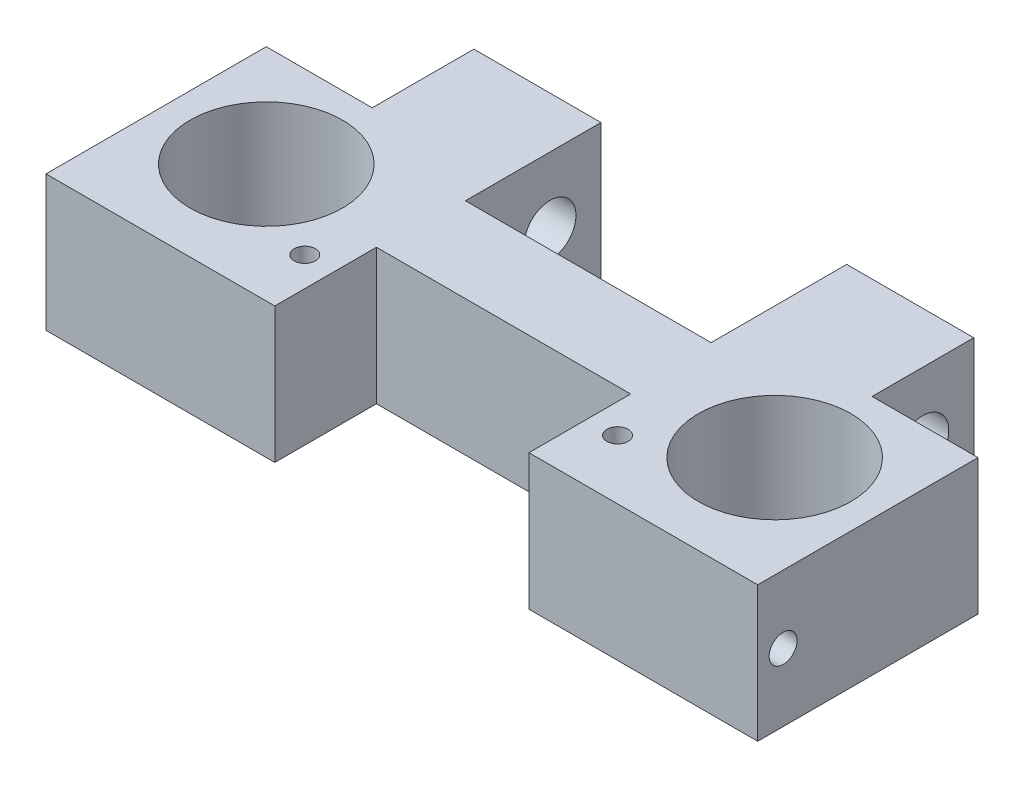
ISO-10303-21;
HEADER;
FILE_DESCRIPTION(('STEP AP214'),'2;1');
FILE_NAME('part.step','',(''),(''),'','','');
FILE_SCHEMA(('AUTOMOTIVE_DESIGN { 1 0 10303 214 1 1 1 1 }'));
ENDSEC;
DATA;
#1=APPLICATION_CONTEXT('core data for automotive mechanical design processes');
#2=APPLICATION_PROTOCOL_DEFINITION('international standard','automotive_design',2000,#1);
#3=PRODUCT_CONTEXT('',#1,'mechanical');
#4=PRODUCT('Part','Part','',(#3));
#5=PRODUCT_RELATED_PRODUCT_CATEGORY('part','',(#4));
#6=PRODUCT_DEFINITION_FORMATION('','',#4);
#7=PRODUCT_DEFINITION_CONTEXT('part definition',#1,'design');
#8=PRODUCT_DEFINITION('design','',#6,#7);
#9=PRODUCT_DEFINITION_SHAPE('','',#8);
#10=(LENGTH_UNIT() NAMED_UNIT(*) SI_UNIT(.MILLI.,.METRE.));
#11=(NAMED_UNIT(*) PLANE_ANGLE_UNIT() SI_UNIT($,.RADIAN.));
#12=(NAMED_UNIT(*) SI_UNIT($,.STERADIAN.) SOLID_ANGLE_UNIT());
#13=UNCERTAINTY_MEASURE_WITH_UNIT(LENGTH_MEASURE(1.E-05),#10,'distance_accuracy_value','');
#14=(GEOMETRIC_REPRESENTATION_CONTEXT(3) GLOBAL_UNCERTAINTY_ASSIGNED_CONTEXT((#13)) GLOBAL_UNIT_ASSIGNED_CONTEXT((#10,
#11,#12)) REPRESENTATION_CONTEXT('',''));
#15=CARTESIAN_POINT('',(0.,0.,0.));
#16=DIRECTION('',(0.,0.,1.));
#17=DIRECTION('',(1.,0.,0.));
#18=AXIS2_PLACEMENT_3D('',#15,#16,#17);
#19=CARTESIAN_POINT('',(-42.,8.00000000000001,13.));
#20=DIRECTION('',(0.,0.,-1.));
#21=DIRECTION('',(-1.,0.,0.));
#22=AXIS2_PLACEMENT_3D('',#19,#20,#21);
#23=PLANE('',#22);
#24=DIRECTION('',(1.,0.,0.));
#25=VECTOR('',#24,1.);
#26=CARTESIAN_POINT('',(-42.,8.00000000000001,13.));
#27=LINE('',#26,#25);
#28=CARTESIAN_POINT('',(15.,8.00000000000001,13.));
#29=VERTEX_POINT('',#28);
#30=CARTESIAN_POINT('',(42.,8.00000000000001,13.));
#31=VERTEX_POINT('',#30);
#32=EDGE_CURVE('E191',#29,#31,#27,.T.);
#33=ORIENTED_EDGE('',*,*,#32,.F.);
#34=DIRECTION('',(0.,-1.,0.));
#35=VECTOR('',#34,1.);
#36=CARTESIAN_POINT('',(15.,8.00100000000001,13.));
#37=LINE('',#36,#35);
#38=CARTESIAN_POINT('',(15.,-8.00000000000001,13.));
#39=VERTEX_POINT('',#38);
#40=EDGE_CURVE('E354',#29,#39,#37,.T.);
#41=ORIENTED_EDGE('',*,*,#40,.T.);
#42=DIRECTION('',(1.,0.,0.));
#43=VECTOR('',#42,1.);
#44=CARTESIAN_POINT('',(-42.,-8.00000000000001,13.));
#45=LINE('',#44,#43);
#46=CARTESIAN_POINT('',(42.,-8.00000000000001,13.));
#47=VERTEX_POINT('',#46);
#48=EDGE_CURVE('E248',#39,#47,#45,.T.);
#49=ORIENTED_EDGE('',*,*,#48,.T.);
#50=DIRECTION('',(0.,-1.,0.));
#51=VECTOR('',#50,1.);
#52=CARTESIAN_POINT('',(42.,8.00000000000001,13.));
#53=LINE('',#52,#51);
#54=EDGE_CURVE('E203',#31,#47,#53,.T.);
#55=ORIENTED_EDGE('',*,*,#54,.F.);
#56=EDGE_LOOP('',(#33,#41,#49,#55));
#57=FACE_BOUND('',#56,.T.);
#58=ADVANCED_FACE('F44',(#57),#23,.F.);
#59=CARTESIAN_POINT('',(0.,8.00000000000001,0.));
#60=DIRECTION('',(0.,1.,0.));
#61=DIRECTION('',(0.,0.,1.));
#62=AXIS2_PLACEMENT_3D('',#59,#60,#61);
#63=PLANE('',#62);
#64=CARTESIAN_POINT('',(-18.4566036193848,8.00000000000001,5.99999999999999));
#65=DIRECTION('',(0.,1.,0.));
#66=DIRECTION('',(0.,0.,1.));
#67=AXIS2_PLACEMENT_3D('',#64,#65,#66);
#68=CIRCLE('',#67,1.24999999999999);
#69=CARTESIAN_POINT('',(-18.4566036193848,8.00000000000001,7.24999999999998));
#70=VERTEX_POINT('',#69);
#71=EDGE_CURVE('E337',#70,#70,#68,.T.);
#72=ORIENTED_EDGE('',*,*,#71,.F.);
#73=EDGE_LOOP('',(#72));
#74=FACE_BOUND('',#73,.T.);
#75=CARTESIAN_POINT('',(18.4566036193848,8.00000000000001,5.99999999999999));
#76=DIRECTION('',(0.,1.,0.));
#77=DIRECTION('',(0.,0.,1.));
#78=AXIS2_PLACEMENT_3D('',#75,#76,#77);
#79=CIRCLE('',#78,1.24999999999999);
#80=CARTESIAN_POINT('',(18.4566036193848,8.00000000000001,7.24999999999998));
#81=VERTEX_POINT('',#80);
#82=EDGE_CURVE('E336',#81,#81,#79,.T.);
#83=ORIENTED_EDGE('',*,*,#82,.F.);
#84=EDGE_LOOP('',(#83));
#85=FACE_BOUND('',#84,.T.);
#86=DIRECTION('',(0.,0.,1.));
#87=VECTOR('',#86,1.);
#88=CARTESIAN_POINT('',(15.,8.00000000000001,0.999999999999994));
#89=LINE('',#88,#87);
#90=CARTESIAN_POINT('',(15.,8.00000000000001,0.999999999999994));
#91=VERTEX_POINT('',#90);
#92=EDGE_CURVE('E393',#91,#29,#89,.T.);
#93=ORIENTED_EDGE('',*,*,#92,.T.);
#94=ORIENTED_EDGE('',*,*,#32,.T.);
#95=DIRECTION('',(0.,0.,-1.));
#96=VECTOR('',#95,1.);
#97=CARTESIAN_POINT('',(42.,8.00000000000001,13.));
#98=LINE('',#97,#96);
#99=CARTESIAN_POINT('',(42.,8.00000000000001,-13.));
#100=VERTEX_POINT('',#99);
#101=EDGE_CURVE('E75',#31,#100,#98,.T.);
#102=ORIENTED_EDGE('',*,*,#101,.T.);
#103=DIRECTION('',(-1.,0.,0.));
#104=VECTOR('',#103,1.);
#105=CARTESIAN_POINT('',(29.5,8.00000000000001,-13.));
#106=LINE('',#105,#104);
#107=CARTESIAN_POINT('',(29.5,8.00000000000001,-13.));
#108=VERTEX_POINT('',#107);
#109=EDGE_CURVE('E254',#100,#108,#106,.T.);
#110=ORIENTED_EDGE('',*,*,#109,.T.);
#111=DIRECTION('',(0.,0.,-1.));
#112=VECTOR('',#111,1.);
#113=CARTESIAN_POINT('',(29.5,8.00000000000001,-13.));
#114=LINE('',#113,#112);
#115=CARTESIAN_POINT('',(29.5,8.00000000000001,-25.));
#116=VERTEX_POINT('',#115);
#117=EDGE_CURVE('E143',#108,#116,#114,.T.);
#118=ORIENTED_EDGE('',*,*,#117,.T.);
#119=DIRECTION('',(-1.,0.,0.));
#120=VECTOR('',#119,1.);
#121=CARTESIAN_POINT('',(29.5,8.00000000000001,-25.));
#122=LINE('',#121,#120);
#123=CARTESIAN_POINT('',(14.5,8.00000000000001,-25.));
#124=VERTEX_POINT('',#123);
#125=EDGE_CURVE('E292',#116,#124,#122,.T.);
#126=ORIENTED_EDGE('',*,*,#125,.T.);
#127=DIRECTION('',(0.,0.,1.));
#128=VECTOR('',#127,1.);
#129=CARTESIAN_POINT('',(14.5,8.00000000000001,-25.));
#130=LINE('',#129,#128);
#131=CARTESIAN_POINT('',(14.5,8.00000000000001,-9.00000000000001));
#132=VERTEX_POINT('',#131);
#133=EDGE_CURVE('E313',#124,#132,#130,.T.);
#134=ORIENTED_EDGE('',*,*,#133,.T.);
#135=DIRECTION('',(-1.,0.,0.));
#136=VECTOR('',#135,1.);
#137=CARTESIAN_POINT('',(-14.5,8.00000000000001,-9.));
#138=LINE('',#137,#136);
#139=CARTESIAN_POINT('',(-14.5,8.00000000000001,-9.));
#140=VERTEX_POINT('',#139);
#141=EDGE_CURVE('E309',#132,#140,#138,.T.);
#142=ORIENTED_EDGE('',*,*,#141,.T.);
#143=DIRECTION('',(0.,0.,-1.));
#144=VECTOR('',#143,1.);
#145=CARTESIAN_POINT('',(-14.5,8.00000000000001,-25.));
#146=LINE('',#145,#144);
#147=CARTESIAN_POINT('',(-14.5,8.00000000000001,-25.));
#148=VERTEX_POINT('',#147);
#149=EDGE_CURVE('E312',#140,#148,#146,.T.);
#150=ORIENTED_EDGE('',*,*,#149,.T.);
#151=DIRECTION('',(-1.,0.,0.));
#152=VECTOR('',#151,1.);
#153=CARTESIAN_POINT('',(-29.5,8.00000000000001,-25.));
#154=LINE('',#153,#152);
#155=CARTESIAN_POINT('',(-29.5,8.00000000000001,-25.));
#156=VERTEX_POINT('',#155);
#157=EDGE_CURVE('E317',#148,#156,#154,.T.);
#158=ORIENTED_EDGE('',*,*,#157,.T.);
#159=DIRECTION('',(0.,0.,1.));
#160=VECTOR('',#159,1.);
#161=CARTESIAN_POINT('',(-29.5,8.00000000000001,-13.));
#162=LINE('',#161,#160);
#163=CARTESIAN_POINT('',(-29.5,8.00000000000001,-13.));
#164=VERTEX_POINT('',#163);
#165=EDGE_CURVE('E325',#156,#164,#162,.T.);
#166=ORIENTED_EDGE('',*,*,#165,.T.);
#167=DIRECTION('',(-1.,0.,0.));
#168=VECTOR('',#167,1.);
#169=CARTESIAN_POINT('',(-42.,8.00000000000001,-13.));
#170=LINE('',#169,#168);
#171=CARTESIAN_POINT('',(-42.,8.00000000000001,-13.));
#172=VERTEX_POINT('',#171);
#173=EDGE_CURVE('E186',#164,#172,#170,.T.);
#174=ORIENTED_EDGE('',*,*,#173,.T.);
#175=DIRECTION('',(0.,0.,1.));
#176=VECTOR('',#175,1.);
#177=CARTESIAN_POINT('',(-42.,8.00000000000001,13.));
#178=LINE('',#177,#176);
#179=CARTESIAN_POINT('',(-42.,8.00000000000001,13.));
#180=VERTEX_POINT('',#179);
#181=EDGE_CURVE('E178',#172,#180,#178,.T.);
#182=ORIENTED_EDGE('',*,*,#181,.T.);
#183=CARTESIAN_POINT('',(-15.,8.00000000000001,13.));
#184=VERTEX_POINT('',#183);
#185=EDGE_CURVE('E184',#180,#184,#27,.T.);
#186=ORIENTED_EDGE('',*,*,#185,.T.);
#187=DIRECTION('',(0.,0.,-1.));
#188=VECTOR('',#187,1.);
#189=CARTESIAN_POINT('',(-15.,8.00000000000001,0.999999999999994));
#190=LINE('',#189,#188);
#191=CARTESIAN_POINT('',(-15.,8.00000000000001,0.999999999999994));
#192=VERTEX_POINT('',#191);
#193=EDGE_CURVE('E63',#184,#192,#190,.T.);
#194=ORIENTED_EDGE('',*,*,#193,.T.);
#195=DIRECTION('',(1.,0.,0.));
#196=VECTOR('',#195,1.);
#197=CARTESIAN_POINT('',(-15.,8.00000000000001,0.999999999999994));
#198=LINE('',#197,#196);
#199=EDGE_CURVE('E389',#192,#91,#198,.T.);
#200=ORIENTED_EDGE('',*,*,#199,.T.);
#201=EDGE_LOOP('',(#93,#94,#102,#110,#118,#126,#134,#142,#150,#158,#166,#174,#182,#186,#194,#200));
#202=FACE_BOUND('',#201,.T.);
#203=CARTESIAN_POINT('',(-30.,8.00000000000001,-1.));
#204=DIRECTION('',(0.,1.,0.));
#205=DIRECTION('',(0.,0.,1.));
#206=AXIS2_PLACEMENT_3D('',#203,#204,#205);
#207=CIRCLE('',#206,9.);
#208=CARTESIAN_POINT('',(-30.,8.00000000000001,8.));
#209=VERTEX_POINT('',#208);
#210=EDGE_CURVE('E222',#209,#209,#207,.T.);
#211=ORIENTED_EDGE('',*,*,#210,.F.);
#212=EDGE_LOOP('',(#211));
#213=FACE_BOUND('',#212,.T.);
#214=CARTESIAN_POINT('',(30.,8.00000000000001,-1.));
#215=DIRECTION('',(0.,1.,0.));
#216=DIRECTION('',(0.,0.,-1.));
#217=AXIS2_PLACEMENT_3D('',#214,#215,#216);
#218=CIRCLE('',#217,9.00000000000001);
#219=CARTESIAN_POINT('',(30.,8.00000000000001,-10.));
#220=VERTEX_POINT('',#219);
#221=EDGE_CURVE('E362',#220,#220,#218,.T.);
#222=ORIENTED_EDGE('',*,*,#221,.F.);
#223=EDGE_LOOP('',(#222));
#224=FACE_BOUND('',#223,.T.);
#225=ADVANCED_FACE('F181',(#74,#85,#202,#213,#224),#63,.T.);
#226=CARTESIAN_POINT('',(0.,-8.00000000000001,0.));
#227=DIRECTION('',(0.,1.,0.));
#228=DIRECTION('',(0.,0.,1.));
#229=AXIS2_PLACEMENT_3D('',#226,#227,#228);
#230=PLANE('',#229);
#231=CARTESIAN_POINT('',(-30.,-8.00000000000001,-1.));
#232=DIRECTION('',(0.,1.,0.));
#233=DIRECTION('',(0.,0.,1.));
#234=AXIS2_PLACEMENT_3D('',#231,#232,#233);
#235=CIRCLE('',#234,9.);
#236=CARTESIAN_POINT('',(-30.,-8.00000000000001,8.));
#237=VERTEX_POINT('',#236);
#238=EDGE_CURVE('E331',#237,#237,#235,.T.);
#239=ORIENTED_EDGE('',*,*,#238,.T.);
#240=EDGE_LOOP('',(#239));
#241=FACE_BOUND('',#240,.T.);
#242=ORIENTED_EDGE('',*,*,#48,.F.);
#243=DIRECTION('',(0.,0.,1.));
#244=VECTOR('',#243,1.);
#245=CARTESIAN_POINT('',(15.,-8.00000000000001,0.999999999999994));
#246=LINE('',#245,#244);
#247=CARTESIAN_POINT('',(15.,-8.00000000000001,0.999999999999994));
#248=VERTEX_POINT('',#247);
#249=EDGE_CURVE('E350',#248,#39,#246,.T.);
#250=ORIENTED_EDGE('',*,*,#249,.F.);
#251=DIRECTION('',(1.,0.,0.));
#252=VECTOR('',#251,1.);
#253=CARTESIAN_POINT('',(-15.,-8.00000000000001,0.999999999999994));
#254=LINE('',#253,#252);
#255=CARTESIAN_POINT('',(-15.,-8.00000000000001,0.999999999999994));
#256=VERTEX_POINT('',#255);
#257=EDGE_CURVE('E349',#256,#248,#254,.T.);
#258=ORIENTED_EDGE('',*,*,#257,.F.);
#259=DIRECTION('',(0.,0.,-1.));
#260=VECTOR('',#259,1.);
#261=CARTESIAN_POINT('',(-15.,-8.00000000000001,0.999999999999994));
#262=LINE('',#261,#260);
#263=CARTESIAN_POINT('',(-15.,-8.00000000000001,13.));
#264=VERTEX_POINT('',#263);
#265=EDGE_CURVE('E346',#264,#256,#262,.T.);
#266=ORIENTED_EDGE('',*,*,#265,.F.);
#267=CARTESIAN_POINT('',(-42.,-8.00000000000001,13.));
#268=VERTEX_POINT('',#267);
#269=EDGE_CURVE('E249',#268,#264,#45,.T.);
#270=ORIENTED_EDGE('',*,*,#269,.F.);
#271=DIRECTION('',(0.,0.,1.));
#272=VECTOR('',#271,1.);
#273=CARTESIAN_POINT('',(-42.,-8.00000000000001,13.));
#274=LINE('',#273,#272);
#275=CARTESIAN_POINT('',(-42.,-8.00000000000001,-13.));
#276=VERTEX_POINT('',#275);
#277=EDGE_CURVE('E197',#276,#268,#274,.T.);
#278=ORIENTED_EDGE('',*,*,#277,.F.);
#279=DIRECTION('',(-1.,0.,0.));
#280=VECTOR('',#279,1.);
#281=CARTESIAN_POINT('',(-42.,-8.00000000000001,-13.));
#282=LINE('',#281,#280);
#283=CARTESIAN_POINT('',(-29.5,-8.00000000000001,-13.));
#284=VERTEX_POINT('',#283);
#285=EDGE_CURVE('E243',#284,#276,#282,.T.);
#286=ORIENTED_EDGE('',*,*,#285,.F.);
#287=DIRECTION('',(0.,0.,1.));
#288=VECTOR('',#287,1.);
#289=CARTESIAN_POINT('',(-29.5,-8.00000000000001,-13.));
#290=LINE('',#289,#288);
#291=CARTESIAN_POINT('',(-29.5,-8.00000000000001,-25.));
#292=VERTEX_POINT('',#291);
#293=EDGE_CURVE('E240',#292,#284,#290,.T.);
#294=ORIENTED_EDGE('',*,*,#293,.F.);
#295=DIRECTION('',(-1.,0.,0.));
#296=VECTOR('',#295,1.);
#297=CARTESIAN_POINT('',(-29.5,-8.00000000000001,-25.));
#298=LINE('',#297,#296);
#299=CARTESIAN_POINT('',(-14.5,-8.00000000000001,-25.));
#300=VERTEX_POINT('',#299);
#301=EDGE_CURVE('E237',#300,#292,#298,.T.);
#302=ORIENTED_EDGE('',*,*,#301,.F.);
#303=DIRECTION('',(0.,0.,-1.));
#304=VECTOR('',#303,1.);
#305=CARTESIAN_POINT('',(-14.5,-8.00000000000001,-25.));
#306=LINE('',#305,#304);
#307=CARTESIAN_POINT('',(-14.5,-8.00000000000001,-9.));
#308=VERTEX_POINT('',#307);
#309=EDGE_CURVE('E234',#308,#300,#306,.T.);
#310=ORIENTED_EDGE('',*,*,#309,.F.);
#311=DIRECTION('',(-1.,0.,0.));
#312=VECTOR('',#311,1.);
#313=CARTESIAN_POINT('',(-14.5,-8.00000000000001,-9.));
#314=LINE('',#313,#312);
#315=CARTESIAN_POINT('',(14.5,-8.00000000000001,-9.00000000000001));
#316=VERTEX_POINT('',#315);
#317=EDGE_CURVE('E231',#316,#308,#314,.T.);
#318=ORIENTED_EDGE('',*,*,#317,.F.);
#319=DIRECTION('',(0.,0.,1.));
#320=VECTOR('',#319,1.);
#321=CARTESIAN_POINT('',(14.5,-8.00000000000001,-25.));
#322=LINE('',#321,#320);
#323=CARTESIAN_POINT('',(14.5,-8.00000000000001,-25.));
#324=VERTEX_POINT('',#323);
#325=EDGE_CURVE('E228',#324,#316,#322,.T.);
#326=ORIENTED_EDGE('',*,*,#325,.F.);
#327=DIRECTION('',(-1.,0.,0.));
#328=VECTOR('',#327,1.);
#329=CARTESIAN_POINT('',(29.5,-8.00000000000001,-25.));
#330=LINE('',#329,#328);
#331=CARTESIAN_POINT('',(29.5,-8.00000000000001,-25.));
#332=VERTEX_POINT('',#331);
#333=EDGE_CURVE('E225',#332,#324,#330,.T.);
#334=ORIENTED_EDGE('',*,*,#333,.F.);
#335=DIRECTION('',(0.,0.,-1.));
#336=VECTOR('',#335,1.);
#337=CARTESIAN_POINT('',(29.5,-8.00000000000001,-13.));
#338=LINE('',#337,#336);
#339=CARTESIAN_POINT('',(29.5,-8.00000000000001,-13.));
#340=VERTEX_POINT('',#339);
#341=EDGE_CURVE('E221',#340,#332,#338,.T.);
#342=ORIENTED_EDGE('',*,*,#341,.F.);
#343=DIRECTION('',(-1.,0.,0.));
#344=VECTOR('',#343,1.);
#345=CARTESIAN_POINT('',(29.5,-8.00000000000001,-13.));
#346=LINE('',#345,#344);
#347=CARTESIAN_POINT('',(42.,-8.00000000000001,-13.));
#348=VERTEX_POINT('',#347);
#349=EDGE_CURVE('E217',#348,#340,#346,.T.);
#350=ORIENTED_EDGE('',*,*,#349,.F.);
#351=DIRECTION('',(0.,0.,-1.));
#352=VECTOR('',#351,1.);
#353=CARTESIAN_POINT('',(42.,-8.00000000000001,13.));
#354=LINE('',#353,#352);
#355=EDGE_CURVE('E132',#47,#348,#354,.T.);
#356=ORIENTED_EDGE('',*,*,#355,.F.);
#357=EDGE_LOOP('',(#242,#250,#258,#266,#270,#278,#286,#294,#302,#310,#318,#326,#334,#342,#350,#356));
#358=FACE_BOUND('',#357,.T.);
#359=CARTESIAN_POINT('',(30.,-8.00000000000001,-1.));
#360=DIRECTION('',(0.,1.,0.));
#361=DIRECTION('',(0.,0.,-1.));
#362=AXIS2_PLACEMENT_3D('',#359,#360,#361);
#363=CIRCLE('',#362,9.00000000000001);
#364=CARTESIAN_POINT('',(30.,-8.00000000000001,-10.));
#365=VERTEX_POINT('',#364);
#366=EDGE_CURVE('E416',#365,#365,#363,.T.);
#367=ORIENTED_EDGE('',*,*,#366,.T.);
#368=EDGE_LOOP('',(#367));
#369=FACE_BOUND('',#368,.T.);
#370=ADVANCED_FACE('F296',(#241,#358,#369),#230,.F.);
#371=CARTESIAN_POINT('',(29.5,8.00000000000001,-13.));
#372=DIRECTION('',(0.,0.,1.));
#373=DIRECTION('',(1.,0.,0.));
#374=AXIS2_PLACEMENT_3D('',#371,#372,#373);
#375=PLANE('',#374);
#376=ORIENTED_EDGE('',*,*,#349,.T.);
#377=DIRECTION('',(0.,-1.,0.));
#378=VECTOR('',#377,1.);
#379=CARTESIAN_POINT('',(29.5,8.00000000000001,-13.));
#380=LINE('',#379,#378);
#381=EDGE_CURVE('E11',#108,#340,#380,.T.);
#382=ORIENTED_EDGE('',*,*,#381,.F.);
#383=ORIENTED_EDGE('',*,*,#109,.F.);
#384=DIRECTION('',(0.,-1.,0.));
#385=VECTOR('',#384,1.);
#386=CARTESIAN_POINT('',(42.,8.00000000000001,-13.));
#387=LINE('',#386,#385);
#388=EDGE_CURVE('E212',#100,#348,#387,.T.);
#389=ORIENTED_EDGE('',*,*,#388,.T.);
#390=EDGE_LOOP('',(#376,#382,#383,#389));
#391=FACE_BOUND('',#390,.T.);
#392=ADVANCED_FACE('F46',(#391),#375,.F.);
#393=CARTESIAN_POINT('',(29.5,8.00000000000001,-13.));
#394=DIRECTION('',(-1.,0.,0.));
#395=DIRECTION('',(0.,0.,1.));
#396=AXIS2_PLACEMENT_3D('',#393,#394,#395);
#397=PLANE('',#396);
#398=CARTESIAN_POINT('',(29.5,0.,-19.));
#399=DIRECTION('',(-1.,0.,0.));
#400=DIRECTION('',(0.,0.,1.));
#401=AXIS2_PLACEMENT_3D('',#398,#399,#400);
#402=CIRCLE('',#401,3.05);
#403=CARTESIAN_POINT('',(29.5,0.,-15.95));
#404=VERTEX_POINT('',#403);
#405=EDGE_CURVE('E412',#404,#404,#402,.T.);
#406=ORIENTED_EDGE('',*,*,#405,.T.);
#407=EDGE_LOOP('',(#406));
#408=FACE_BOUND('',#407,.T.);
#409=ORIENTED_EDGE('',*,*,#341,.T.);
#410=DIRECTION('',(0.,-1.,0.));
#411=VECTOR('',#410,1.);
#412=CARTESIAN_POINT('',(29.5,8.00000000000001,-25.));
#413=LINE('',#412,#411);
#414=EDGE_CURVE('E53',#116,#332,#413,.T.);
#415=ORIENTED_EDGE('',*,*,#414,.F.);
#416=ORIENTED_EDGE('',*,*,#117,.F.);
#417=ORIENTED_EDGE('',*,*,#381,.T.);
#418=EDGE_LOOP('',(#409,#415,#416,#417));
#419=FACE_BOUND('',#418,.T.);
#420=ADVANCED_FACE('F429',(#408,#419),#397,.F.);
#421=CARTESIAN_POINT('',(29.5,8.00000000000001,-25.));
#422=DIRECTION('',(0.,0.,1.));
#423=DIRECTION('',(1.,0.,0.));
#424=AXIS2_PLACEMENT_3D('',#421,#422,#423);
#425=PLANE('',#424);
#426=ORIENTED_EDGE('',*,*,#333,.T.);
#427=DIRECTION('',(0.,-1.,0.));
#428=VECTOR('',#427,1.);
#429=CARTESIAN_POINT('',(14.5,8.00000000000001,-25.));
#430=LINE('',#429,#428);
#431=EDGE_CURVE('E281',#124,#324,#430,.T.);
#432=ORIENTED_EDGE('',*,*,#431,.F.);
#433=ORIENTED_EDGE('',*,*,#125,.F.);
#434=ORIENTED_EDGE('',*,*,#414,.T.);
#435=EDGE_LOOP('',(#426,#432,#433,#434));
#436=FACE_BOUND('',#435,.T.);
#437=ADVANCED_FACE('F290',(#436),#425,.F.);
#438=CARTESIAN_POINT('',(14.5,8.00000000000001,-25.));
#439=DIRECTION('',(1.,0.,0.));
#440=DIRECTION('',(0.,0.,-1.));
#441=AXIS2_PLACEMENT_3D('',#438,#439,#440);
#442=PLANE('',#441);
#443=CARTESIAN_POINT('',(14.5,0.,-19.));
#444=DIRECTION('',(1.,0.,0.));
#445=DIRECTION('',(0.,0.,-1.));
#446=AXIS2_PLACEMENT_3D('',#443,#444,#445);
#447=CIRCLE('',#446,3.05);
#448=CARTESIAN_POINT('',(14.5,0.,-22.05));
#449=VERTEX_POINT('',#448);
#450=EDGE_CURVE('E408',#449,#449,#447,.T.);
#451=ORIENTED_EDGE('',*,*,#450,.T.);
#452=EDGE_LOOP('',(#451));
#453=FACE_BOUND('',#452,.T.);
#454=ORIENTED_EDGE('',*,*,#325,.T.);
#455=DIRECTION('',(0.,-1.,0.));
#456=VECTOR('',#455,1.);
#457=CARTESIAN_POINT('',(14.5,8.00000000000001,-9.00000000000001));
#458=LINE('',#457,#456);
#459=EDGE_CURVE('E277',#132,#316,#458,.T.);
#460=ORIENTED_EDGE('',*,*,#459,.F.);
#461=ORIENTED_EDGE('',*,*,#133,.F.);
#462=ORIENTED_EDGE('',*,*,#431,.T.);
#463=EDGE_LOOP('',(#454,#460,#461,#462));
#464=FACE_BOUND('',#463,.T.);
#465=ADVANCED_FACE('F303',(#453,#464),#442,.F.);
#466=CARTESIAN_POINT('',(-14.5,8.00000000000001,-9.));
#467=DIRECTION('',(0.,0.,1.));
#468=DIRECTION('',(1.,0.,0.));
#469=AXIS2_PLACEMENT_3D('',#466,#467,#468);
#470=PLANE('',#469);
#471=ORIENTED_EDGE('',*,*,#317,.T.);
#472=DIRECTION('',(0.,-1.,0.));
#473=VECTOR('',#472,1.);
#474=CARTESIAN_POINT('',(-14.5,8.00000000000001,-9.));
#475=LINE('',#474,#473);
#476=EDGE_CURVE('E273',#140,#308,#475,.T.);
#477=ORIENTED_EDGE('',*,*,#476,.F.);
#478=ORIENTED_EDGE('',*,*,#141,.F.);
#479=ORIENTED_EDGE('',*,*,#459,.T.);
#480=EDGE_LOOP('',(#471,#477,#478,#479));
#481=FACE_BOUND('',#480,.T.);
#482=ADVANCED_FACE('F307',(#481),#470,.F.);
#483=CARTESIAN_POINT('',(-14.5,8.00000000000001,-25.));
#484=DIRECTION('',(-1.,0.,0.));
#485=DIRECTION('',(0.,0.,1.));
#486=AXIS2_PLACEMENT_3D('',#483,#484,#485);
#487=PLANE('',#486);
#488=CARTESIAN_POINT('',(-14.5,0.,-19.));
#489=DIRECTION('',(-1.,0.,0.));
#490=DIRECTION('',(0.,0.,1.));
#491=AXIS2_PLACEMENT_3D('',#488,#489,#490);
#492=CIRCLE('',#491,3.05);
#493=CARTESIAN_POINT('',(-14.5,0.,-15.95));
#494=VERTEX_POINT('',#493);
#495=EDGE_CURVE('E342',#494,#494,#492,.T.);
#496=ORIENTED_EDGE('',*,*,#495,.T.);
#497=EDGE_LOOP('',(#496));
#498=FACE_BOUND('',#497,.T.);
#499=ORIENTED_EDGE('',*,*,#309,.T.);
#500=DIRECTION('',(0.,-1.,0.));
#501=VECTOR('',#500,1.);
#502=CARTESIAN_POINT('',(-14.5,8.00000000000001,-25.));
#503=LINE('',#502,#501);
#504=EDGE_CURVE('E269',#148,#300,#503,.T.);
#505=ORIENTED_EDGE('',*,*,#504,.F.);
#506=ORIENTED_EDGE('',*,*,#149,.F.);
#507=ORIENTED_EDGE('',*,*,#476,.T.);
#508=EDGE_LOOP('',(#499,#505,#506,#507));
#509=FACE_BOUND('',#508,.T.);
#510=ADVANCED_FACE('F471',(#498,#509),#487,.F.);
#511=CARTESIAN_POINT('',(-29.5,8.00000000000001,-25.));
#512=DIRECTION('',(0.,0.,1.));
#513=DIRECTION('',(1.,0.,0.));
#514=AXIS2_PLACEMENT_3D('',#511,#512,#513);
#515=PLANE('',#514);
#516=ORIENTED_EDGE('',*,*,#301,.T.);
#517=DIRECTION('',(0.,-1.,0.));
#518=VECTOR('',#517,1.);
#519=CARTESIAN_POINT('',(-29.5,8.00000000000001,-25.));
#520=LINE('',#519,#518);
#521=EDGE_CURVE('E265',#156,#292,#520,.T.);
#522=ORIENTED_EDGE('',*,*,#521,.F.);
#523=ORIENTED_EDGE('',*,*,#157,.F.);
#524=ORIENTED_EDGE('',*,*,#504,.T.);
#525=EDGE_LOOP('',(#516,#522,#523,#524));
#526=FACE_BOUND('',#525,.T.);
#527=ADVANCED_FACE('F467',(#526),#515,.F.);
#528=CARTESIAN_POINT('',(-29.5,8.00000000000001,-13.));
#529=DIRECTION('',(1.,0.,0.));
#530=DIRECTION('',(0.,0.,-1.));
#531=AXIS2_PLACEMENT_3D('',#528,#529,#530);
#532=PLANE('',#531);
#533=CARTESIAN_POINT('',(-29.5,0.,-19.));
#534=DIRECTION('',(-1.,0.,0.));
#535=DIRECTION('',(0.,0.,1.));
#536=AXIS2_PLACEMENT_3D('',#533,#534,#535);
#537=CIRCLE('',#536,3.05);
#538=CARTESIAN_POINT('',(-29.5,0.,-15.95));
#539=VERTEX_POINT('',#538);
#540=EDGE_CURVE('E340',#539,#539,#537,.T.);
#541=ORIENTED_EDGE('',*,*,#540,.F.);
#542=EDGE_LOOP('',(#541));
#543=FACE_BOUND('',#542,.T.);
#544=ORIENTED_EDGE('',*,*,#293,.T.);
#545=DIRECTION('',(0.,-1.,0.));
#546=VECTOR('',#545,1.);
#547=CARTESIAN_POINT('',(-29.5,8.00000000000001,-13.));
#548=LINE('',#547,#546);
#549=EDGE_CURVE('E261',#164,#284,#548,.T.);
#550=ORIENTED_EDGE('',*,*,#549,.F.);
#551=ORIENTED_EDGE('',*,*,#165,.F.);
#552=ORIENTED_EDGE('',*,*,#521,.T.);
#553=EDGE_LOOP('',(#544,#550,#551,#552));
#554=FACE_BOUND('',#553,.T.);
#555=ADVANCED_FACE('F461',(#543,#554),#532,.F.);
#556=CARTESIAN_POINT('',(-42.,8.00000000000001,-13.));
#557=DIRECTION('',(0.,0.,1.));
#558=DIRECTION('',(1.,0.,0.));
#559=AXIS2_PLACEMENT_3D('',#556,#557,#558);
#560=PLANE('',#559);
#561=ORIENTED_EDGE('',*,*,#285,.T.);
#562=DIRECTION('',(0.,-1.,0.));
#563=VECTOR('',#562,1.);
#564=CARTESIAN_POINT('',(-42.,8.00000000000001,-13.));
#565=LINE('',#564,#563);
#566=EDGE_CURVE('E202',#172,#276,#565,.T.);
#567=ORIENTED_EDGE('',*,*,#566,.F.);
#568=ORIENTED_EDGE('',*,*,#173,.F.);
#569=ORIENTED_EDGE('',*,*,#549,.T.);
#570=EDGE_LOOP('',(#561,#567,#568,#569));
#571=FACE_BOUND('',#570,.T.);
#572=ADVANCED_FACE('F456',(#571),#560,.F.);
#573=CARTESIAN_POINT('',(-42.,8.00000000000001,13.));
#574=DIRECTION('',(1.,0.,0.));
#575=DIRECTION('',(0.,0.,-1.));
#576=AXIS2_PLACEMENT_3D('',#573,#574,#575);
#577=PLANE('',#576);
#578=CARTESIAN_POINT('',(-42.,0.,10.));
#579=DIRECTION('',(-1.,0.,0.));
#580=DIRECTION('',(0.,0.,1.));
#581=AXIS2_PLACEMENT_3D('',#578,#579,#580);
#582=CIRCLE('',#581,1.64999999999999);
#583=CARTESIAN_POINT('',(-42.,0.,11.65));
#584=VERTEX_POINT('',#583);
#585=EDGE_CURVE('E367',#584,#584,#582,.T.);
#586=ORIENTED_EDGE('',*,*,#585,.F.);
#587=EDGE_LOOP('',(#586));
#588=FACE_BOUND('',#587,.T.);
#589=ORIENTED_EDGE('',*,*,#277,.T.);
#590=DIRECTION('',(0.,-1.,0.));
#591=VECTOR('',#590,1.);
#592=CARTESIAN_POINT('',(-42.,8.00000000000001,13.));
#593=LINE('',#592,#591);
#594=EDGE_CURVE('E194',#180,#268,#593,.T.);
#595=ORIENTED_EDGE('',*,*,#594,.F.);
#596=ORIENTED_EDGE('',*,*,#181,.F.);
#597=ORIENTED_EDGE('',*,*,#566,.T.);
#598=EDGE_LOOP('',(#589,#595,#596,#597));
#599=FACE_BOUND('',#598,.T.);
#600=ADVANCED_FACE('F195',(#588,#599),#577,.F.);
#601=ORIENTED_EDGE('',*,*,#269,.T.);
#602=DIRECTION('',(0.,-1.,0.));
#603=VECTOR('',#602,1.);
#604=CARTESIAN_POINT('',(-15.,8.00100000000001,13.));
#605=LINE('',#604,#603);
#606=EDGE_CURVE('E206',#184,#264,#605,.T.);
#607=ORIENTED_EDGE('',*,*,#606,.F.);
#608=ORIENTED_EDGE('',*,*,#185,.F.);
#609=ORIENTED_EDGE('',*,*,#594,.T.);
#610=EDGE_LOOP('',(#601,#607,#608,#609));
#611=FACE_BOUND('',#610,.T.);
#612=ADVANCED_FACE('F205',(#611),#23,.F.);
#613=CARTESIAN_POINT('',(42.,8.00000000000001,13.));
#614=DIRECTION('',(-1.,0.,0.));
#615=DIRECTION('',(0.,0.,1.));
#616=AXIS2_PLACEMENT_3D('',#613,#614,#615);
#617=PLANE('',#616);
#618=CARTESIAN_POINT('',(42.,0.,10.));
#619=DIRECTION('',(1.,0.,0.));
#620=DIRECTION('',(0.,0.,-1.));
#621=AXIS2_PLACEMENT_3D('',#618,#619,#620);
#622=CIRCLE('',#621,1.64999999999999);
#623=CARTESIAN_POINT('',(42.,0.,8.35000000000001));
#624=VERTEX_POINT('',#623);
#625=EDGE_CURVE('E366',#624,#624,#622,.T.);
#626=ORIENTED_EDGE('',*,*,#625,.F.);
#627=EDGE_LOOP('',(#626));
#628=FACE_BOUND('',#627,.T.);
#629=ORIENTED_EDGE('',*,*,#355,.T.);
#630=ORIENTED_EDGE('',*,*,#388,.F.);
#631=ORIENTED_EDGE('',*,*,#101,.F.);
#632=ORIENTED_EDGE('',*,*,#54,.T.);
#633=EDGE_LOOP('',(#629,#630,#631,#632));
#634=FACE_BOUND('',#633,.T.);
#635=ADVANCED_FACE('F449',(#628,#634),#617,.F.);
#636=CARTESIAN_POINT('',(-30.,8.00000000000001,-1.));
#637=DIRECTION('',(0.,-1.,0.));
#638=DIRECTION('',(0.,0.,-1.));
#639=AXIS2_PLACEMENT_3D('',#636,#637,#638);
#640=CYLINDRICAL_SURFACE('',#639,9.);
#641=ORIENTED_EDGE('',*,*,#210,.T.);
#642=EDGE_LOOP('',(#641));
#643=FACE_BOUND('',#642,.T.);
#644=ORIENTED_EDGE('',*,*,#238,.F.);
#645=EDGE_LOOP('',(#644));
#646=FACE_BOUND('',#645,.T.);
#647=ADVANCED_FACE('F454',(#643,#646),#640,.F.);
#648=CARTESIAN_POINT('',(30.,8.00000000000001,-1.));
#649=DIRECTION('',(0.,-1.,0.));
#650=DIRECTION('',(0.,0.,-1.));
#651=AXIS2_PLACEMENT_3D('',#648,#649,#650);
#652=CYLINDRICAL_SURFACE('',#651,9.00000000000001);
#653=ORIENTED_EDGE('',*,*,#221,.T.);
#654=EDGE_LOOP('',(#653));
#655=FACE_BOUND('',#654,.T.);
#656=ORIENTED_EDGE('',*,*,#366,.F.);
#657=EDGE_LOOP('',(#656));
#658=FACE_BOUND('',#657,.T.);
#659=ADVANCED_FACE('F498',(#655,#658),#652,.F.);
#660=CARTESIAN_POINT('',(42.,0.,-19.));
#661=DIRECTION('',(-1.,0.,0.));
#662=DIRECTION('',(0.,0.,1.));
#663=AXIS2_PLACEMENT_3D('',#660,#661,#662);
#664=CYLINDRICAL_SURFACE('',#663,3.05);
#665=ORIENTED_EDGE('',*,*,#540,.T.);
#666=EDGE_LOOP('',(#665));
#667=FACE_BOUND('',#666,.T.);
#668=ORIENTED_EDGE('',*,*,#495,.F.);
#669=EDGE_LOOP('',(#668));
#670=FACE_BOUND('',#669,.T.);
#671=ADVANCED_FACE('F488',(#667,#670),#664,.F.);
#672=ORIENTED_EDGE('',*,*,#450,.F.);
#673=EDGE_LOOP('',(#672));
#674=FACE_BOUND('',#673,.T.);
#675=ORIENTED_EDGE('',*,*,#405,.F.);
#676=EDGE_LOOP('',(#675));
#677=FACE_BOUND('',#676,.T.);
#678=ADVANCED_FACE('F484',(#674,#677),#664,.F.);
#679=CARTESIAN_POINT('',(15.,8.00100000000001,0.999999999999994));
#680=DIRECTION('',(1.,0.,0.));
#681=DIRECTION('',(0.,0.,-1.));
#682=AXIS2_PLACEMENT_3D('',#679,#680,#681);
#683=PLANE('',#682);
#684=DIRECTION('',(0.,-1.,0.));
#685=VECTOR('',#684,1.);
#686=CARTESIAN_POINT('',(15.,8.00100000000001,0.999999999999994));
#687=LINE('',#686,#685);
#688=EDGE_CURVE('E343',#91,#248,#687,.T.);
#689=ORIENTED_EDGE('',*,*,#688,.T.);
#690=ORIENTED_EDGE('',*,*,#249,.T.);
#691=ORIENTED_EDGE('',*,*,#40,.F.);
#692=ORIENTED_EDGE('',*,*,#92,.F.);
#693=EDGE_LOOP('',(#689,#690,#691,#692));
#694=FACE_BOUND('',#693,.T.);
#695=ADVANCED_FACE('F487',(#694),#683,.F.);
#696=CARTESIAN_POINT('',(-15.,8.00100000000001,0.999999999999994));
#697=DIRECTION('',(0.,0.,-1.));
#698=DIRECTION('',(-1.,0.,0.));
#699=AXIS2_PLACEMENT_3D('',#696,#697,#698);
#700=PLANE('',#699);
#701=DIRECTION('',(0.,-1.,0.));
#702=VECTOR('',#701,1.);
#703=CARTESIAN_POINT('',(-15.,8.00100000000001,0.999999999999994));
#704=LINE('',#703,#702);
#705=EDGE_CURVE('E356',#192,#256,#704,.T.);
#706=ORIENTED_EDGE('',*,*,#705,.T.);
#707=ORIENTED_EDGE('',*,*,#257,.T.);
#708=ORIENTED_EDGE('',*,*,#688,.F.);
#709=ORIENTED_EDGE('',*,*,#199,.F.);
#710=EDGE_LOOP('',(#706,#707,#708,#709));
#711=FACE_BOUND('',#710,.T.);
#712=ADVANCED_FACE('F495',(#711),#700,.F.);
#713=CARTESIAN_POINT('',(-15.,8.00100000000001,0.999999999999994));
#714=DIRECTION('',(-1.,0.,0.));
#715=DIRECTION('',(0.,0.,1.));
#716=AXIS2_PLACEMENT_3D('',#713,#714,#715);
#717=PLANE('',#716);
#718=ORIENTED_EDGE('',*,*,#606,.T.);
#719=ORIENTED_EDGE('',*,*,#265,.T.);
#720=ORIENTED_EDGE('',*,*,#705,.F.);
#721=ORIENTED_EDGE('',*,*,#193,.F.);
#722=EDGE_LOOP('',(#718,#719,#720,#721));
#723=FACE_BOUND('',#722,.T.);
#724=ADVANCED_FACE('F621',(#723),#717,.F.);
#725=CARTESIAN_POINT('',(32.5,0.,10.));
#726=DIRECTION('',(1.,0.,0.));
#727=DIRECTION('',(0.,0.,-1.));
#728=AXIS2_PLACEMENT_3D('',#725,#726,#727);
#729=CONICAL_SURFACE('',#728,1.65,1.02974425867665);
#730=CARTESIAN_POINT('',(31.5085799786045,0.,10.));
#731=VERTEX_POINT('',#730);
#732=VERTEX_LOOP('',#731);
#733=FACE_BOUND('',#732,.T.);
#734=CARTESIAN_POINT('',(32.5,0.,10.));
#735=DIRECTION('',(1.,0.,0.));
#736=DIRECTION('',(0.,0.,-1.));
#737=AXIS2_PLACEMENT_3D('',#734,#735,#736);
#738=CIRCLE('',#737,1.65);
#739=CARTESIAN_POINT('',(32.5,0.,8.35));
#740=VERTEX_POINT('',#739);
#741=EDGE_CURVE('E383',#740,#740,#738,.T.);
#742=ORIENTED_EDGE('',*,*,#741,.T.);
#743=EDGE_LOOP('',(#742));
#744=FACE_BOUND('',#743,.T.);
#745=ADVANCED_FACE('F631',(#733,#744),#729,.F.);
#746=CARTESIAN_POINT('',(42.,0.,10.));
#747=DIRECTION('',(1.,0.,0.));
#748=DIRECTION('',(0.,0.,-1.));
#749=AXIS2_PLACEMENT_3D('',#746,#747,#748);
#750=CYLINDRICAL_SURFACE('',#749,1.64999999999999);
#751=ORIENTED_EDGE('',*,*,#741,.F.);
#752=EDGE_LOOP('',(#751));
#753=FACE_BOUND('',#752,.T.);
#754=ORIENTED_EDGE('',*,*,#625,.T.);
#755=EDGE_LOOP('',(#754));
#756=FACE_BOUND('',#755,.T.);
#757=ADVANCED_FACE('F638',(#753,#756),#750,.F.);
#758=CARTESIAN_POINT('',(-32.5,0.,10.));
#759=DIRECTION('',(-1.,0.,0.));
#760=DIRECTION('',(0.,0.,1.));
#761=AXIS2_PLACEMENT_3D('',#758,#759,#760);
#762=CONICAL_SURFACE('',#761,1.65,1.02974425867665);
#763=CARTESIAN_POINT('',(-31.5085799786045,0.,10.));
#764=VERTEX_POINT('',#763);
#765=VERTEX_LOOP('',#764);
#766=FACE_BOUND('',#765,.T.);
#767=CARTESIAN_POINT('',(-32.5,0.,10.));
#768=DIRECTION('',(-1.,0.,0.));
#769=DIRECTION('',(0.,0.,1.));
#770=AXIS2_PLACEMENT_3D('',#767,#768,#769);
#771=CIRCLE('',#770,1.65);
#772=CARTESIAN_POINT('',(-32.5,0.,11.65));
#773=VERTEX_POINT('',#772);
#774=EDGE_CURVE('E364',#773,#773,#771,.T.);
#775=ORIENTED_EDGE('',*,*,#774,.T.);
#776=EDGE_LOOP('',(#775));
#777=FACE_BOUND('',#776,.T.);
#778=ADVANCED_FACE('F649',(#766,#777),#762,.F.);
#779=CARTESIAN_POINT('',(-42.,0.,10.));
#780=DIRECTION('',(-1.,0.,0.));
#781=DIRECTION('',(0.,0.,1.));
#782=AXIS2_PLACEMENT_3D('',#779,#780,#781);
#783=CYLINDRICAL_SURFACE('',#782,1.64999999999999);
#784=ORIENTED_EDGE('',*,*,#774,.F.);
#785=EDGE_LOOP('',(#784));
#786=FACE_BOUND('',#785,.T.);
#787=ORIENTED_EDGE('',*,*,#585,.T.);
#788=EDGE_LOOP('',(#787));
#789=FACE_BOUND('',#788,.T.);
#790=ADVANCED_FACE('F660',(#786,#789),#783,.F.);
#791=CARTESIAN_POINT('',(18.4566036193848,-0.5,5.99999999999999));
#792=DIRECTION('',(0.,1.,0.));
#793=DIRECTION('',(0.,0.,1.));
#794=AXIS2_PLACEMENT_3D('',#791,#792,#793);
#795=CONICAL_SURFACE('',#794,1.24999999999999,1.02974425867665);
#796=CARTESIAN_POINT('',(18.4566036193848,-1.25107577378444,5.99999999999999));
#797=VERTEX_POINT('',#796);
#798=VERTEX_LOOP('',#797);
#799=FACE_BOUND('',#798,.T.);
#800=CARTESIAN_POINT('',(18.4566036193848,-0.5,5.99999999999999));
#801=DIRECTION('',(0.,1.,0.));
#802=DIRECTION('',(0.,0.,1.));
#803=AXIS2_PLACEMENT_3D('',#800,#801,#802);
#804=CIRCLE('',#803,1.24999999999999);
#805=CARTESIAN_POINT('',(18.4566036193848,-0.5,7.24999999999998));
#806=VERTEX_POINT('',#805);
#807=EDGE_CURVE('E371',#806,#806,#804,.T.);
#808=ORIENTED_EDGE('',*,*,#807,.T.);
#809=EDGE_LOOP('',(#808));
#810=FACE_BOUND('',#809,.T.);
#811=ADVANCED_FACE('F670',(#799,#810),#795,.F.);
#812=CARTESIAN_POINT('',(18.4566036193848,8.00000000000001,5.99999999999999));
#813=DIRECTION('',(0.,1.,0.));
#814=DIRECTION('',(0.,0.,1.));
#815=AXIS2_PLACEMENT_3D('',#812,#813,#814);
#816=CYLINDRICAL_SURFACE('',#815,1.24999999999999);
#817=ORIENTED_EDGE('',*,*,#807,.F.);
#818=EDGE_LOOP('',(#817));
#819=FACE_BOUND('',#818,.T.);
#820=ORIENTED_EDGE('',*,*,#82,.T.);
#821=EDGE_LOOP('',(#820));
#822=FACE_BOUND('',#821,.T.);
#823=ADVANCED_FACE('F680',(#819,#822),#816,.F.);
#824=CARTESIAN_POINT('',(-18.4566036193848,-0.5,5.99999999999999));
#825=DIRECTION('',(0.,1.,0.));
#826=DIRECTION('',(0.,0.,1.));
#827=AXIS2_PLACEMENT_3D('',#824,#825,#826);
#828=CONICAL_SURFACE('',#827,1.24999999999999,1.02974425867665);
#829=CARTESIAN_POINT('',(-18.4566036193848,-1.25107577378444,5.99999999999999));
#830=VERTEX_POINT('',#829);
#831=VERTEX_LOOP('',#830);
#832=FACE_BOUND('',#831,.T.);
#833=CARTESIAN_POINT('',(-18.4566036193848,-0.5,5.99999999999999));
#834=DIRECTION('',(0.,1.,0.));
#835=DIRECTION('',(0.,0.,1.));
#836=AXIS2_PLACEMENT_3D('',#833,#834,#835);
#837=CIRCLE('',#836,1.24999999999999);
#838=CARTESIAN_POINT('',(-18.4566036193848,-0.5,7.24999999999998));
#839=VERTEX_POINT('',#838);
#840=EDGE_CURVE('E334',#839,#839,#837,.T.);
#841=ORIENTED_EDGE('',*,*,#840,.T.);
#842=EDGE_LOOP('',(#841));
#843=FACE_BOUND('',#842,.T.);
#844=ADVANCED_FACE('F691',(#832,#843),#828,.F.);
#845=CARTESIAN_POINT('',(-18.4566036193848,8.00000000000001,5.99999999999999));
#846=DIRECTION('',(0.,1.,0.));
#847=DIRECTION('',(0.,0.,1.));
#848=AXIS2_PLACEMENT_3D('',#845,#846,#847);
#849=CYLINDRICAL_SURFACE('',#848,1.24999999999999);
#850=ORIENTED_EDGE('',*,*,#840,.F.);
#851=EDGE_LOOP('',(#850));
#852=FACE_BOUND('',#851,.T.);
#853=ORIENTED_EDGE('',*,*,#71,.T.);
#854=EDGE_LOOP('',(#853));
#855=FACE_BOUND('',#854,.T.);
#856=ADVANCED_FACE('F702',(#852,#855),#849,.F.);
#857=CLOSED_SHELL('',(#58,#225,#370,#392,#420,#437,#465,#482,#510,#527,#555,#572,#600,#612,#635,
#647,#659,#671,#678,#695,#712,#724,#745,#757,#778,#790,#811,#823,#844,#856));
#858=MANIFOLD_SOLID_BREP('B2',#857);
#859=ADVANCED_BREP_SHAPE_REPRESENTATION('',(#18,#858),#14);
#860=SHAPE_DEFINITION_REPRESENTATION(#9,#859);
ENDSEC;
END-ISO-10303-21;
